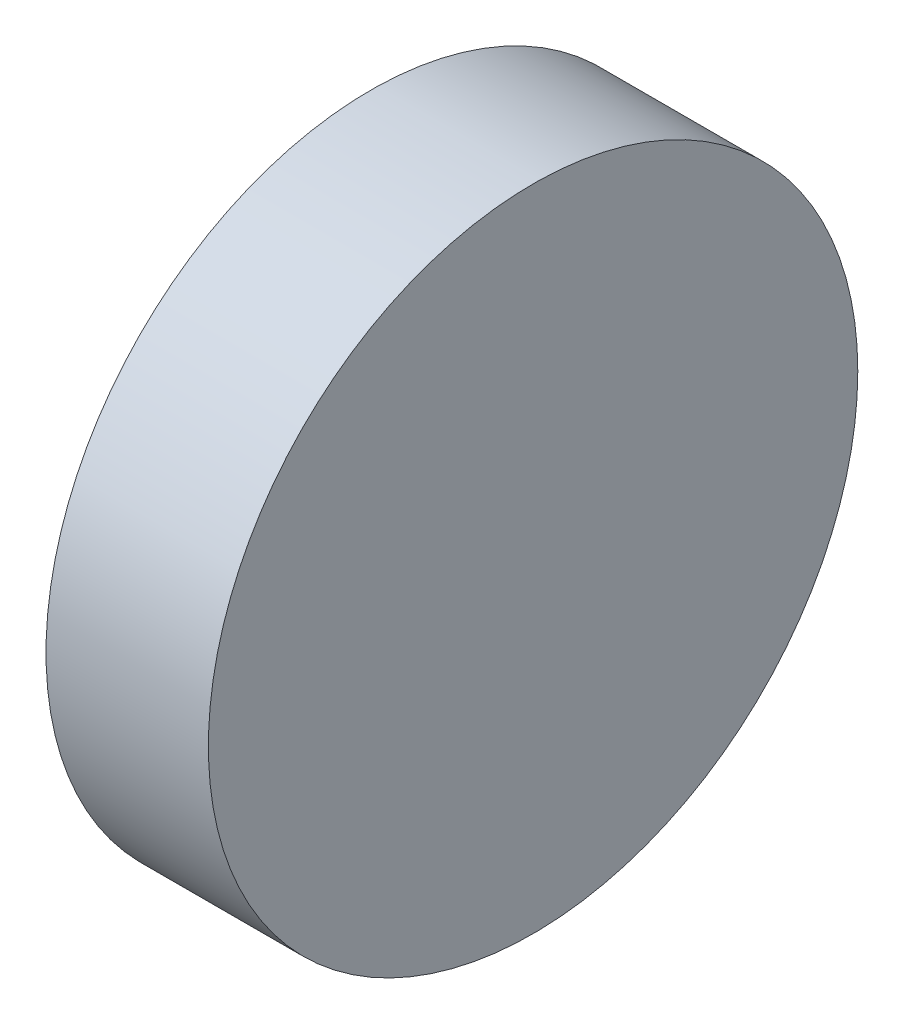
ISO-10303-21;
HEADER;
FILE_DESCRIPTION(('STEP AP214'),'2;1');
FILE_NAME('part.step','',(''),(''),'','','');
FILE_SCHEMA(('AUTOMOTIVE_DESIGN { 1 0 10303 214 1 1 1 1 }'));
ENDSEC;
DATA;
#1=APPLICATION_CONTEXT('core data for automotive mechanical design processes');
#2=APPLICATION_PROTOCOL_DEFINITION('international standard','automotive_design',2000,#1);
#3=PRODUCT_CONTEXT('',#1,'mechanical');
#4=PRODUCT('Part','Part','',(#3));
#5=PRODUCT_RELATED_PRODUCT_CATEGORY('part','',(#4));
#6=PRODUCT_DEFINITION_FORMATION('','',#4);
#7=PRODUCT_DEFINITION_CONTEXT('part definition',#1,'design');
#8=PRODUCT_DEFINITION('design','',#6,#7);
#9=PRODUCT_DEFINITION_SHAPE('','',#8);
#10=(LENGTH_UNIT() NAMED_UNIT(*) SI_UNIT(.MILLI.,.METRE.));
#11=(NAMED_UNIT(*) PLANE_ANGLE_UNIT() SI_UNIT($,.RADIAN.));
#12=(NAMED_UNIT(*) SI_UNIT($,.STERADIAN.) SOLID_ANGLE_UNIT());
#13=UNCERTAINTY_MEASURE_WITH_UNIT(LENGTH_MEASURE(1.E-05),#10,'distance_accuracy_value','');
#14=(GEOMETRIC_REPRESENTATION_CONTEXT(3) GLOBAL_UNCERTAINTY_ASSIGNED_CONTEXT((#13)) GLOBAL_UNIT_ASSIGNED_CONTEXT((#10,
#11,#12)) REPRESENTATION_CONTEXT('',''));
#15=CARTESIAN_POINT('',(0.,0.,0.));
#16=DIRECTION('',(0.,0.,1.));
#17=DIRECTION('',(1.,0.,0.));
#18=AXIS2_PLACEMENT_3D('',#15,#16,#17);
#19=CARTESIAN_POINT('',(12.7,0.,0.));
#20=DIRECTION('',(-1.,0.,0.));
#21=DIRECTION('',(0.,0.,1.));
#22=AXIS2_PLACEMENT_3D('',#19,#20,#21);
#23=CYLINDRICAL_SURFACE('',#22,25.4);
#24=CARTESIAN_POINT('',(12.7,0.,0.));
#25=DIRECTION('',(1.,0.,0.));
#26=DIRECTION('',(0.,0.,-1.));
#27=AXIS2_PLACEMENT_3D('',#24,#25,#26);
#28=CIRCLE('',#27,25.4);
#29=CARTESIAN_POINT('',(12.7,0.,-25.4));
#30=VERTEX_POINT('',#29);
#31=EDGE_CURVE('E10',#30,#30,#28,.T.);
#32=ORIENTED_EDGE('',*,*,#31,.F.);
#33=EDGE_LOOP('',(#32));
#34=FACE_BOUND('',#33,.T.);
#35=CARTESIAN_POINT('',(0.,0.,0.));
#36=DIRECTION('',(1.,0.,0.));
#37=DIRECTION('',(0.,0.,-1.));
#38=AXIS2_PLACEMENT_3D('',#35,#36,#37);
#39=CIRCLE('',#38,25.4);
#40=CARTESIAN_POINT('',(0.,0.,-25.4));
#41=VERTEX_POINT('',#40);
#42=EDGE_CURVE('E38',#41,#41,#39,.T.);
#43=ORIENTED_EDGE('',*,*,#42,.T.);
#44=EDGE_LOOP('',(#43));
#45=FACE_BOUND('',#44,.T.);
#46=ADVANCED_FACE('F35',(#34,#45),#23,.T.);
#47=CARTESIAN_POINT('',(12.7,0.,0.));
#48=DIRECTION('',(1.,0.,0.));
#49=DIRECTION('',(0.,0.,-1.));
#50=AXIS2_PLACEMENT_3D('',#47,#48,#49);
#51=PLANE('',#50);
#52=ORIENTED_EDGE('',*,*,#31,.T.);
#53=EDGE_LOOP('',(#52));
#54=FACE_BOUND('',#53,.T.);
#55=ADVANCED_FACE('F50',(#54),#51,.T.);
#56=CARTESIAN_POINT('',(0.,0.,0.));
#57=DIRECTION('',(1.,0.,0.));
#58=DIRECTION('',(0.,0.,-1.));
#59=AXIS2_PLACEMENT_3D('',#56,#57,#58);
#60=PLANE('',#59);
#61=ORIENTED_EDGE('',*,*,#42,.F.);
#62=EDGE_LOOP('',(#61));
#63=FACE_BOUND('',#62,.T.);
#64=ADVANCED_FACE('F48',(#63),#60,.F.);
#65=CLOSED_SHELL('',(#46,#55,#64));
#66=MANIFOLD_SOLID_BREP('B2',#65);
#67=ADVANCED_BREP_SHAPE_REPRESENTATION('',(#18,#66),#14);
#68=SHAPE_DEFINITION_REPRESENTATION(#9,#67);
ENDSEC;
END-ISO-10303-21;
